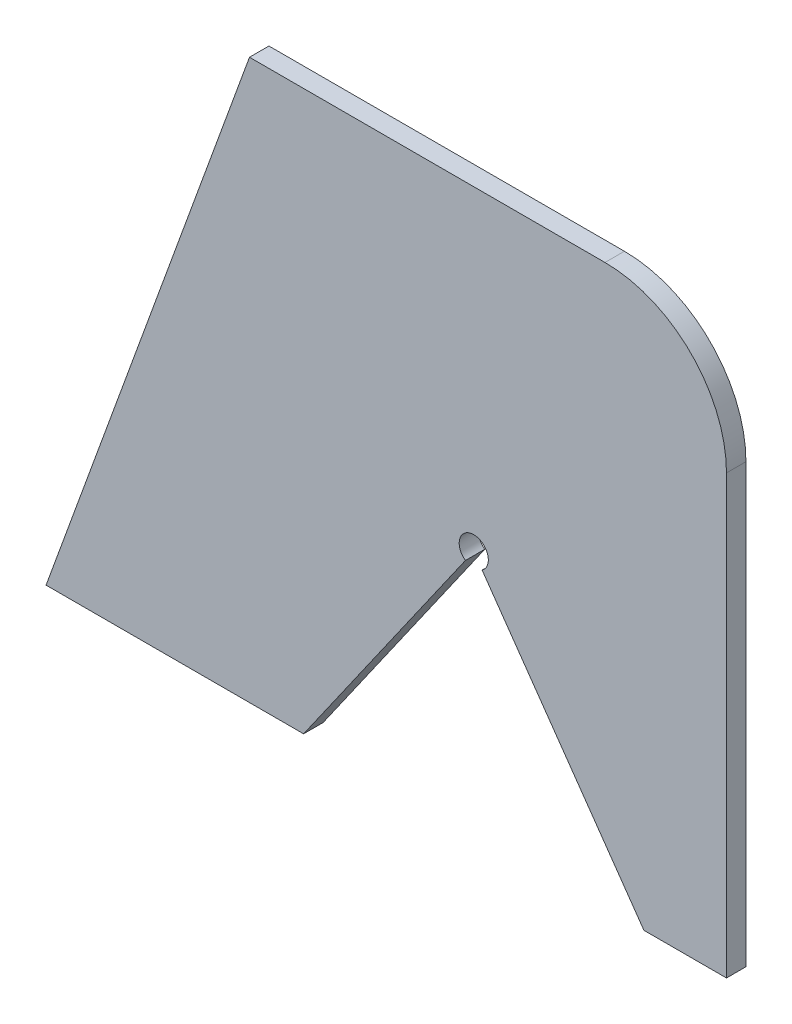
ISO-10303-21;
HEADER;
FILE_DESCRIPTION(('STEP AP214'),'2;1');
FILE_NAME('part.step','',(''),(''),'','','');
FILE_SCHEMA(('AUTOMOTIVE_DESIGN { 1 0 10303 214 1 1 1 1 }'));
ENDSEC;
DATA;
#1=APPLICATION_CONTEXT('core data for automotive mechanical design processes');
#2=APPLICATION_PROTOCOL_DEFINITION('international standard','automotive_design',2000,#1);
#3=PRODUCT_CONTEXT('',#1,'mechanical');
#4=PRODUCT('Part','Part','',(#3));
#5=PRODUCT_RELATED_PRODUCT_CATEGORY('part','',(#4));
#6=PRODUCT_DEFINITION_FORMATION('','',#4);
#7=PRODUCT_DEFINITION_CONTEXT('part definition',#1,'design');
#8=PRODUCT_DEFINITION('design','',#6,#7);
#9=PRODUCT_DEFINITION_SHAPE('','',#8);
#10=(LENGTH_UNIT() NAMED_UNIT(*) SI_UNIT(.MILLI.,.METRE.));
#11=(NAMED_UNIT(*) PLANE_ANGLE_UNIT() SI_UNIT($,.RADIAN.));
#12=(NAMED_UNIT(*) SI_UNIT($,.STERADIAN.) SOLID_ANGLE_UNIT());
#13=UNCERTAINTY_MEASURE_WITH_UNIT(LENGTH_MEASURE(1.E-05),#10,'distance_accuracy_value','');
#14=(GEOMETRIC_REPRESENTATION_CONTEXT(3) GLOBAL_UNCERTAINTY_ASSIGNED_CONTEXT((#13)) GLOBAL_UNIT_ASSIGNED_CONTEXT((#10,
#11,#12)) REPRESENTATION_CONTEXT('',''));
#15=CARTESIAN_POINT('',(0.,0.,0.));
#16=DIRECTION('',(0.,0.,1.));
#17=DIRECTION('',(1.,0.,0.));
#18=AXIS2_PLACEMENT_3D('',#15,#16,#17);
#19=CARTESIAN_POINT('',(41.8565769406138,115.,4.));
#20=DIRECTION('',(0.939692620785907,-0.342020143325673,0.));
#21=DIRECTION('',(0.342020143325673,0.939692620785907,0.));
#22=AXIS2_PLACEMENT_3D('',#19,#20,#21);
#23=PLANE('',#22);
#24=DIRECTION('',(-0.342020143325673,-0.939692620785907,0.));
#25=VECTOR('',#24,1.);
#26=CARTESIAN_POINT('',(41.8565769406138,115.,0.));
#27=LINE('',#26,#25);
#28=CARTESIAN_POINT('',(41.8565769406138,115.,0.));
#29=VERTEX_POINT('',#28);
#30=CARTESIAN_POINT('',(0.,0.,0.));
#31=VERTEX_POINT('',#30);
#32=EDGE_CURVE('E135',#29,#31,#27,.T.);
#33=ORIENTED_EDGE('',*,*,#32,.T.);
#34=DIRECTION('',(0.,0.,-1.));
#35=VECTOR('',#34,1.);
#36=CARTESIAN_POINT('',(0.,0.,4.));
#37=LINE('',#36,#35);
#38=CARTESIAN_POINT('',(0.,0.,4.));
#39=VERTEX_POINT('',#38);
#40=EDGE_CURVE('E11',#39,#31,#37,.T.);
#41=ORIENTED_EDGE('',*,*,#40,.F.);
#42=DIRECTION('',(-0.342020143325673,-0.939692620785907,0.));
#43=VECTOR('',#42,1.);
#44=CARTESIAN_POINT('',(41.8565769406138,115.,4.));
#45=LINE('',#44,#43);
#46=CARTESIAN_POINT('',(41.8565769406138,115.,4.));
#47=VERTEX_POINT('',#46);
#48=EDGE_CURVE('E151',#47,#39,#45,.T.);
#49=ORIENTED_EDGE('',*,*,#48,.F.);
#50=DIRECTION('',(0.,0.,-1.));
#51=VECTOR('',#50,1.);
#52=CARTESIAN_POINT('',(41.8565769406138,115.,4.));
#53=LINE('',#52,#51);
#54=EDGE_CURVE('E131',#47,#29,#53,.T.);
#55=ORIENTED_EDGE('',*,*,#54,.T.);
#56=EDGE_LOOP('',(#33,#41,#49,#55));
#57=FACE_BOUND('',#56,.T.);
#58=ADVANCED_FACE('F33',(#57),#23,.F.);
#59=CARTESIAN_POINT('',(0.,0.,4.));
#60=DIRECTION('',(0.,1.,0.));
#61=DIRECTION('',(-1.,0.,0.));
#62=AXIS2_PLACEMENT_3D('',#59,#60,#61);
#63=PLANE('',#62);
#64=DIRECTION('',(1.,0.,0.));
#65=VECTOR('',#64,1.);
#66=CARTESIAN_POINT('',(0.,0.,0.));
#67=LINE('',#66,#65);
#68=CARTESIAN_POINT('',(52.9896230895149,0.,0.));
#69=VERTEX_POINT('',#68);
#70=EDGE_CURVE('E138',#31,#69,#67,.T.);
#71=ORIENTED_EDGE('',*,*,#70,.T.);
#72=DIRECTION('',(0.,0.,-1.));
#73=VECTOR('',#72,1.);
#74=CARTESIAN_POINT('',(52.9896230895149,0.,4.));
#75=LINE('',#74,#73);
#76=CARTESIAN_POINT('',(52.9896230895149,0.,4.));
#77=VERTEX_POINT('',#76);
#78=EDGE_CURVE('E41',#77,#69,#75,.T.);
#79=ORIENTED_EDGE('',*,*,#78,.F.);
#80=DIRECTION('',(1.,0.,0.));
#81=VECTOR('',#80,1.);
#82=CARTESIAN_POINT('',(0.,0.,4.));
#83=LINE('',#82,#81);
#84=EDGE_CURVE('E95',#39,#77,#83,.T.);
#85=ORIENTED_EDGE('',*,*,#84,.F.);
#86=ORIENTED_EDGE('',*,*,#40,.T.);
#87=EDGE_LOOP('',(#71,#79,#85,#86));
#88=FACE_BOUND('',#87,.T.);
#89=ADVANCED_FACE('F194',(#88),#63,.F.);
#90=CARTESIAN_POINT('',(52.9896230895149,0.,4.));
#91=DIRECTION('',(-0.819152044288995,0.573576436351042,0.));
#92=DIRECTION('',(-0.573576436351042,-0.819152044288995,0.));
#93=AXIS2_PLACEMENT_3D('',#90,#91,#92);
#94=PLANE('',#93);
#95=DIRECTION('',(0.573576436351042,0.819152044288995,0.));
#96=VECTOR('',#95,1.);
#97=CARTESIAN_POINT('',(52.9896230895149,0.,0.));
#98=LINE('',#97,#96);
#99=CARTESIAN_POINT('',(86.2792706909469,47.542543867133,0.));
#100=VERTEX_POINT('',#99);
#101=EDGE_CURVE('E140',#69,#100,#98,.T.);
#102=ORIENTED_EDGE('',*,*,#101,.T.);
#103=DIRECTION('',(0.,0.,-1.));
#104=VECTOR('',#103,1.);
#105=CARTESIAN_POINT('',(86.2792706909469,47.542543867133,4.));
#106=LINE('',#105,#104);
#107=CARTESIAN_POINT('',(86.2792706909469,47.542543867133,4.));
#108=VERTEX_POINT('',#107);
#109=EDGE_CURVE('E161',#108,#100,#106,.T.);
#110=ORIENTED_EDGE('',*,*,#109,.F.);
#111=DIRECTION('',(0.573576436351042,0.819152044288995,0.));
#112=VECTOR('',#111,1.);
#113=CARTESIAN_POINT('',(52.9896230895149,0.,4.));
#114=LINE('',#113,#112);
#115=EDGE_CURVE('E169',#77,#108,#114,.T.);
#116=ORIENTED_EDGE('',*,*,#115,.F.);
#117=ORIENTED_EDGE('',*,*,#78,.T.);
#118=EDGE_LOOP('',(#102,#110,#116,#117));
#119=FACE_BOUND('',#118,.T.);
#120=ADVANCED_FACE('F167',(#119),#94,.F.);
#121=CARTESIAN_POINT('',(88.,50.,4.));
#122=DIRECTION('',(0.,0.,-1.));
#123=DIRECTION('',(-1.,0.,0.));
#124=AXIS2_PLACEMENT_3D('',#121,#122,#123);
#125=CYLINDRICAL_SURFACE('',#124,3.00000000000001);
#126=CARTESIAN_POINT('',(88.,50.,0.));
#127=DIRECTION('',(0.,0.,-1.));
#128=DIRECTION('',(1.,0.,0.));
#129=AXIS2_PLACEMENT_3D('',#126,#127,#128);
#130=CIRCLE('',#129,3.00000000000001);
#131=CARTESIAN_POINT('',(89.7207293090532,47.542543867133,0.));
#132=VERTEX_POINT('',#131);
#133=EDGE_CURVE('E142',#100,#132,#130,.T.);
#134=ORIENTED_EDGE('',*,*,#133,.T.);
#135=DIRECTION('',(0.,0.,-1.));
#136=VECTOR('',#135,1.);
#137=CARTESIAN_POINT('',(89.7207293090532,47.542543867133,4.));
#138=LINE('',#137,#136);
#139=CARTESIAN_POINT('',(89.7207293090532,47.542543867133,4.));
#140=VERTEX_POINT('',#139);
#141=EDGE_CURVE('E158',#140,#132,#138,.T.);
#142=ORIENTED_EDGE('',*,*,#141,.F.);
#143=CARTESIAN_POINT('',(88.,50.,4.));
#144=DIRECTION('',(0.,0.,-1.));
#145=DIRECTION('',(1.,0.,0.));
#146=AXIS2_PLACEMENT_3D('',#143,#144,#145);
#147=CIRCLE('',#146,3.00000000000001);
#148=EDGE_CURVE('E185',#108,#140,#147,.T.);
#149=ORIENTED_EDGE('',*,*,#148,.F.);
#150=ORIENTED_EDGE('',*,*,#109,.T.);
#151=EDGE_LOOP('',(#134,#142,#149,#150));
#152=FACE_BOUND('',#151,.T.);
#153=ADVANCED_FACE('F178',(#152),#125,.F.);
#154=CARTESIAN_POINT('',(89.7207293090532,47.542543867133,4.));
#155=DIRECTION('',(0.819152044288991,0.573576436351047,0.));
#156=DIRECTION('',(-0.573576436351047,0.819152044288991,0.));
#157=AXIS2_PLACEMENT_3D('',#154,#155,#156);
#158=PLANE('',#157);
#159=DIRECTION('',(0.573576436351047,-0.819152044288991,0.));
#160=VECTOR('',#159,1.);
#161=CARTESIAN_POINT('',(89.7207293090532,47.542543867133,0.));
#162=LINE('',#161,#160);
#163=CARTESIAN_POINT('',(123.010376910486,0.,0.));
#164=VERTEX_POINT('',#163);
#165=EDGE_CURVE('E144',#132,#164,#162,.T.);
#166=ORIENTED_EDGE('',*,*,#165,.T.);
#167=DIRECTION('',(0.,0.,-1.));
#168=VECTOR('',#167,1.);
#169=CARTESIAN_POINT('',(123.010376910486,0.,4.));
#170=LINE('',#169,#168);
#171=CARTESIAN_POINT('',(123.010376910486,0.,4.));
#172=VERTEX_POINT('',#171);
#173=EDGE_CURVE('E155',#172,#164,#170,.T.);
#174=ORIENTED_EDGE('',*,*,#173,.F.);
#175=DIRECTION('',(0.573576436351047,-0.819152044288991,0.));
#176=VECTOR('',#175,1.);
#177=CARTESIAN_POINT('',(89.7207293090532,47.542543867133,4.));
#178=LINE('',#177,#176);
#179=EDGE_CURVE('E184',#140,#172,#178,.T.);
#180=ORIENTED_EDGE('',*,*,#179,.F.);
#181=ORIENTED_EDGE('',*,*,#141,.T.);
#182=EDGE_LOOP('',(#166,#174,#180,#181));
#183=FACE_BOUND('',#182,.T.);
#184=ADVANCED_FACE('F182',(#183),#158,.F.);
#185=CARTESIAN_POINT('',(123.010376910486,0.,4.));
#186=DIRECTION('',(0.,1.,0.));
#187=DIRECTION('',(0.,0.,1.));
#188=AXIS2_PLACEMENT_3D('',#185,#186,#187);
#189=PLANE('',#188);
#190=DIRECTION('',(1.,0.,0.));
#191=VECTOR('',#190,1.);
#192=CARTESIAN_POINT('',(123.010376910486,0.,0.));
#193=LINE('',#192,#191);
#194=CARTESIAN_POINT('',(140.,0.,0.));
#195=VERTEX_POINT('',#194);
#196=EDGE_CURVE('E146',#164,#195,#193,.T.);
#197=ORIENTED_EDGE('',*,*,#196,.T.);
#198=DIRECTION('',(0.,0.,-1.));
#199=VECTOR('',#198,1.);
#200=CARTESIAN_POINT('',(140.,0.,4.));
#201=LINE('',#200,#199);
#202=CARTESIAN_POINT('',(140.,0.,4.));
#203=VERTEX_POINT('',#202);
#204=EDGE_CURVE('E126',#203,#195,#201,.T.);
#205=ORIENTED_EDGE('',*,*,#204,.F.);
#206=DIRECTION('',(1.,0.,0.));
#207=VECTOR('',#206,1.);
#208=CARTESIAN_POINT('',(123.010376910486,0.,4.));
#209=LINE('',#208,#207);
#210=EDGE_CURVE('E117',#172,#203,#209,.T.);
#211=ORIENTED_EDGE('',*,*,#210,.F.);
#212=ORIENTED_EDGE('',*,*,#173,.T.);
#213=EDGE_LOOP('',(#197,#205,#211,#212));
#214=FACE_BOUND('',#213,.T.);
#215=ADVANCED_FACE('F206',(#214),#189,.F.);
#216=CARTESIAN_POINT('',(140.,0.,4.));
#217=DIRECTION('',(-1.,0.,0.));
#218=DIRECTION('',(0.,0.,1.));
#219=AXIS2_PLACEMENT_3D('',#216,#217,#218);
#220=PLANE('',#219);
#221=DIRECTION('',(0.,1.,0.));
#222=VECTOR('',#221,1.);
#223=CARTESIAN_POINT('',(140.,0.,0.));
#224=LINE('',#223,#222);
#225=CARTESIAN_POINT('',(140.,89.9999999999998,0.));
#226=VERTEX_POINT('',#225);
#227=EDGE_CURVE('E125',#195,#226,#224,.T.);
#228=ORIENTED_EDGE('',*,*,#227,.T.);
#229=DIRECTION('',(0.,0.,-1.));
#230=VECTOR('',#229,1.);
#231=CARTESIAN_POINT('',(140.,89.9999999999998,4.));
#232=LINE('',#231,#230);
#233=CARTESIAN_POINT('',(140.,89.9999999999998,4.));
#234=VERTEX_POINT('',#233);
#235=EDGE_CURVE('E122',#234,#226,#232,.T.);
#236=ORIENTED_EDGE('',*,*,#235,.F.);
#237=DIRECTION('',(0.,1.,0.));
#238=VECTOR('',#237,1.);
#239=CARTESIAN_POINT('',(140.,0.,4.));
#240=LINE('',#239,#238);
#241=EDGE_CURVE('E111',#203,#234,#240,.T.);
#242=ORIENTED_EDGE('',*,*,#241,.F.);
#243=ORIENTED_EDGE('',*,*,#204,.T.);
#244=EDGE_LOOP('',(#228,#236,#242,#243));
#245=FACE_BOUND('',#244,.T.);
#246=ADVANCED_FACE('F123',(#245),#220,.F.);
#247=CARTESIAN_POINT('',(115.,90.,4.));
#248=DIRECTION('',(0.,0.,-1.));
#249=DIRECTION('',(-1.,0.,0.));
#250=AXIS2_PLACEMENT_3D('',#247,#248,#249);
#251=CYLINDRICAL_SURFACE('',#250,25.);
#252=CARTESIAN_POINT('',(115.,90.,0.));
#253=DIRECTION('',(0.,0.,1.));
#254=DIRECTION('',(-1.,0.,0.));
#255=AXIS2_PLACEMENT_3D('',#252,#253,#254);
#256=CIRCLE('',#255,25.);
#257=CARTESIAN_POINT('',(115.,115.,0.));
#258=VERTEX_POINT('',#257);
#259=EDGE_CURVE('E81',#226,#258,#256,.T.);
#260=ORIENTED_EDGE('',*,*,#259,.T.);
#261=DIRECTION('',(0.,0.,-1.));
#262=VECTOR('',#261,1.);
#263=CARTESIAN_POINT('',(115.,115.,4.));
#264=LINE('',#263,#262);
#265=CARTESIAN_POINT('',(115.,115.,4.));
#266=VERTEX_POINT('',#265);
#267=EDGE_CURVE('E127',#266,#258,#264,.T.);
#268=ORIENTED_EDGE('',*,*,#267,.F.);
#269=CARTESIAN_POINT('',(115.,90.,4.));
#270=DIRECTION('',(0.,0.,1.));
#271=DIRECTION('',(-1.,0.,0.));
#272=AXIS2_PLACEMENT_3D('',#269,#270,#271);
#273=CIRCLE('',#272,25.);
#274=EDGE_CURVE('E115',#234,#266,#273,.T.);
#275=ORIENTED_EDGE('',*,*,#274,.F.);
#276=ORIENTED_EDGE('',*,*,#235,.T.);
#277=EDGE_LOOP('',(#260,#268,#275,#276));
#278=FACE_BOUND('',#277,.T.);
#279=ADVANCED_FACE('F129',(#278),#251,.T.);
#280=CARTESIAN_POINT('',(115.,115.,4.));
#281=DIRECTION('',(0.,-1.,0.));
#282=DIRECTION('',(1.,0.,0.));
#283=AXIS2_PLACEMENT_3D('',#280,#281,#282);
#284=PLANE('',#283);
#285=DIRECTION('',(-1.,0.,0.));
#286=VECTOR('',#285,1.);
#287=CARTESIAN_POINT('',(115.,115.,0.));
#288=LINE('',#287,#286);
#289=EDGE_CURVE('E87',#258,#29,#288,.T.);
#290=ORIENTED_EDGE('',*,*,#289,.T.);
#291=ORIENTED_EDGE('',*,*,#54,.F.);
#292=DIRECTION('',(-1.,0.,0.));
#293=VECTOR('',#292,1.);
#294=CARTESIAN_POINT('',(115.,115.,4.));
#295=LINE('',#294,#293);
#296=EDGE_CURVE('E49',#266,#47,#295,.T.);
#297=ORIENTED_EDGE('',*,*,#296,.F.);
#298=ORIENTED_EDGE('',*,*,#267,.T.);
#299=EDGE_LOOP('',(#290,#291,#297,#298));
#300=FACE_BOUND('',#299,.T.);
#301=ADVANCED_FACE('F214',(#300),#284,.F.);
#302=CARTESIAN_POINT('',(88.,50.,4.));
#303=DIRECTION('',(0.,0.,1.));
#304=DIRECTION('',(1.,0.,0.));
#305=AXIS2_PLACEMENT_3D('',#302,#303,#304);
#306=PLANE('',#305);
#307=ORIENTED_EDGE('',*,*,#48,.T.);
#308=ORIENTED_EDGE('',*,*,#84,.T.);
#309=ORIENTED_EDGE('',*,*,#115,.T.);
#310=ORIENTED_EDGE('',*,*,#148,.T.);
#311=ORIENTED_EDGE('',*,*,#179,.T.);
#312=ORIENTED_EDGE('',*,*,#210,.T.);
#313=ORIENTED_EDGE('',*,*,#241,.T.);
#314=ORIENTED_EDGE('',*,*,#274,.T.);
#315=ORIENTED_EDGE('',*,*,#296,.T.);
#316=EDGE_LOOP('',(#307,#308,#309,#310,#311,#312,#313,#314,#315));
#317=FACE_BOUND('',#316,.T.);
#318=ADVANCED_FACE('F113',(#317),#306,.T.);
#319=CARTESIAN_POINT('',(88.,50.,0.));
#320=DIRECTION('',(0.,0.,1.));
#321=DIRECTION('',(1.,0.,0.));
#322=AXIS2_PLACEMENT_3D('',#319,#320,#321);
#323=PLANE('',#322);
#324=ORIENTED_EDGE('',*,*,#32,.F.);
#325=ORIENTED_EDGE('',*,*,#289,.F.);
#326=ORIENTED_EDGE('',*,*,#259,.F.);
#327=ORIENTED_EDGE('',*,*,#227,.F.);
#328=ORIENTED_EDGE('',*,*,#196,.F.);
#329=ORIENTED_EDGE('',*,*,#165,.F.);
#330=ORIENTED_EDGE('',*,*,#133,.F.);
#331=ORIENTED_EDGE('',*,*,#101,.F.);
#332=ORIENTED_EDGE('',*,*,#70,.F.);
#333=EDGE_LOOP('',(#324,#325,#326,#327,#328,#329,#330,#331,#332));
#334=FACE_BOUND('',#333,.T.);
#335=ADVANCED_FACE('F173',(#334),#323,.F.);
#336=CLOSED_SHELL('',(#58,#89,#120,#153,#184,#215,#246,#279,#301,#318,#335));
#337=MANIFOLD_SOLID_BREP('B2',#336);
#338=ADVANCED_BREP_SHAPE_REPRESENTATION('',(#18,#337),#14);
#339=SHAPE_DEFINITION_REPRESENTATION(#9,#338);
ENDSEC;
END-ISO-10303-21;
